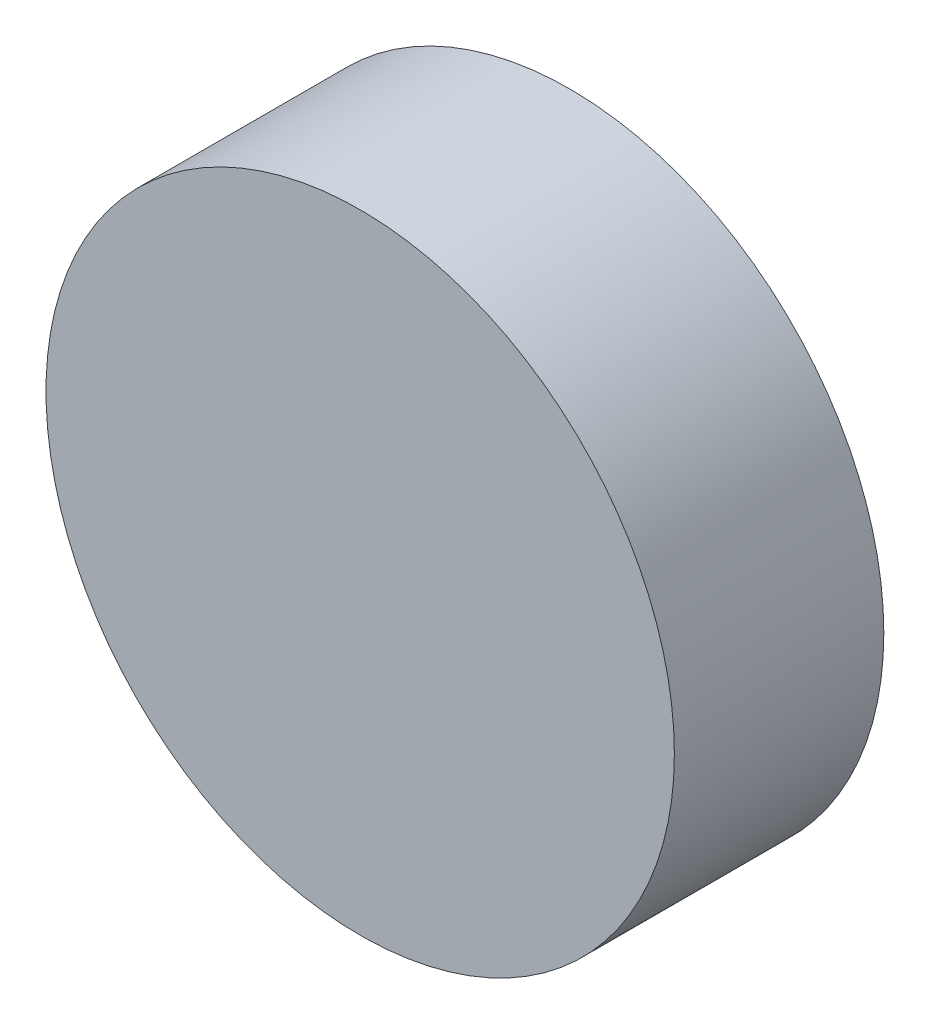
ISO-10303-21;
HEADER;
FILE_DESCRIPTION(('STEP AP214'),'2;1');
FILE_NAME('part.step','',(''),(''),'','','');
FILE_SCHEMA(('AUTOMOTIVE_DESIGN { 1 0 10303 214 1 1 1 1 }'));
ENDSEC;
DATA;
#1=APPLICATION_CONTEXT('core data for automotive mechanical design processes');
#2=APPLICATION_PROTOCOL_DEFINITION('international standard','automotive_design',2000,#1);
#3=PRODUCT_CONTEXT('',#1,'mechanical');
#4=PRODUCT('Part','Part','',(#3));
#5=PRODUCT_RELATED_PRODUCT_CATEGORY('part','',(#4));
#6=PRODUCT_DEFINITION_FORMATION('','',#4);
#7=PRODUCT_DEFINITION_CONTEXT('part definition',#1,'design');
#8=PRODUCT_DEFINITION('design','',#6,#7);
#9=PRODUCT_DEFINITION_SHAPE('','',#8);
#10=(LENGTH_UNIT() NAMED_UNIT(*) SI_UNIT(.MILLI.,.METRE.));
#11=(NAMED_UNIT(*) PLANE_ANGLE_UNIT() SI_UNIT($,.RADIAN.));
#12=(NAMED_UNIT(*) SI_UNIT($,.STERADIAN.) SOLID_ANGLE_UNIT());
#13=UNCERTAINTY_MEASURE_WITH_UNIT(LENGTH_MEASURE(1.E-05),#10,'distance_accuracy_value','');
#14=(GEOMETRIC_REPRESENTATION_CONTEXT(3) GLOBAL_UNCERTAINTY_ASSIGNED_CONTEXT((#13)) GLOBAL_UNIT_ASSIGNED_CONTEXT((#10,
#11,#12)) REPRESENTATION_CONTEXT('',''));
#15=CARTESIAN_POINT('',(0.,0.,0.));
#16=DIRECTION('',(0.,0.,1.));
#17=DIRECTION('',(1.,0.,0.));
#18=AXIS2_PLACEMENT_3D('',#15,#16,#17);
#19=CARTESIAN_POINT('',(0.,0.,4.));
#20=DIRECTION('',(0.,0.,-1.));
#21=DIRECTION('',(-1.,0.,0.));
#22=AXIS2_PLACEMENT_3D('',#19,#20,#21);
#23=CYLINDRICAL_SURFACE('',#22,12.);
#24=CARTESIAN_POINT('',(0.,0.,4.));
#25=DIRECTION('',(0.,0.,1.));
#26=DIRECTION('',(1.,0.,0.));
#27=AXIS2_PLACEMENT_3D('',#24,#25,#26);
#28=CIRCLE('',#27,12.);
#29=CARTESIAN_POINT('',(12.,0.,4.));
#30=VERTEX_POINT('',#29);
#31=EDGE_CURVE('E10',#30,#30,#28,.T.);
#32=ORIENTED_EDGE('',*,*,#31,.F.);
#33=EDGE_LOOP('',(#32));
#34=FACE_BOUND('',#33,.T.);
#35=CARTESIAN_POINT('',(0.,0.,-4.));
#36=DIRECTION('',(0.,0.,1.));
#37=DIRECTION('',(1.,0.,0.));
#38=AXIS2_PLACEMENT_3D('',#35,#36,#37);
#39=CIRCLE('',#38,12.);
#40=CARTESIAN_POINT('',(12.,0.,-4.));
#41=VERTEX_POINT('',#40);
#42=EDGE_CURVE('E47',#41,#41,#39,.T.);
#43=ORIENTED_EDGE('',*,*,#42,.T.);
#44=EDGE_LOOP('',(#43));
#45=FACE_BOUND('',#44,.T.);
#46=ADVANCED_FACE('F44',(#34,#45),#23,.T.);
#47=CARTESIAN_POINT('',(0.,0.,4.));
#48=DIRECTION('',(0.,0.,1.));
#49=DIRECTION('',(1.,0.,0.));
#50=AXIS2_PLACEMENT_3D('',#47,#48,#49);
#51=PLANE('',#50);
#52=ORIENTED_EDGE('',*,*,#31,.T.);
#53=EDGE_LOOP('',(#52));
#54=FACE_BOUND('',#53,.T.);
#55=ADVANCED_FACE('F63',(#54),#51,.T.);
#56=CARTESIAN_POINT('',(0.,0.,-4.));
#57=DIRECTION('',(0.,0.,1.));
#58=DIRECTION('',(1.,0.,0.));
#59=AXIS2_PLACEMENT_3D('',#56,#57,#58);
#60=PLANE('',#59);
#61=ORIENTED_EDGE('',*,*,#42,.F.);
#62=EDGE_LOOP('',(#61));
#63=FACE_BOUND('',#62,.T.);
#64=ADVANCED_FACE('F56',(#63),#60,.F.);
#65=CLOSED_SHELL('',(#46,#55,#64));
#66=MANIFOLD_SOLID_BREP('B2',#65);
#67=ADVANCED_BREP_SHAPE_REPRESENTATION('',(#18,#66),#14);
#68=SHAPE_DEFINITION_REPRESENTATION(#9,#67);
ENDSEC;
END-ISO-10303-21;
